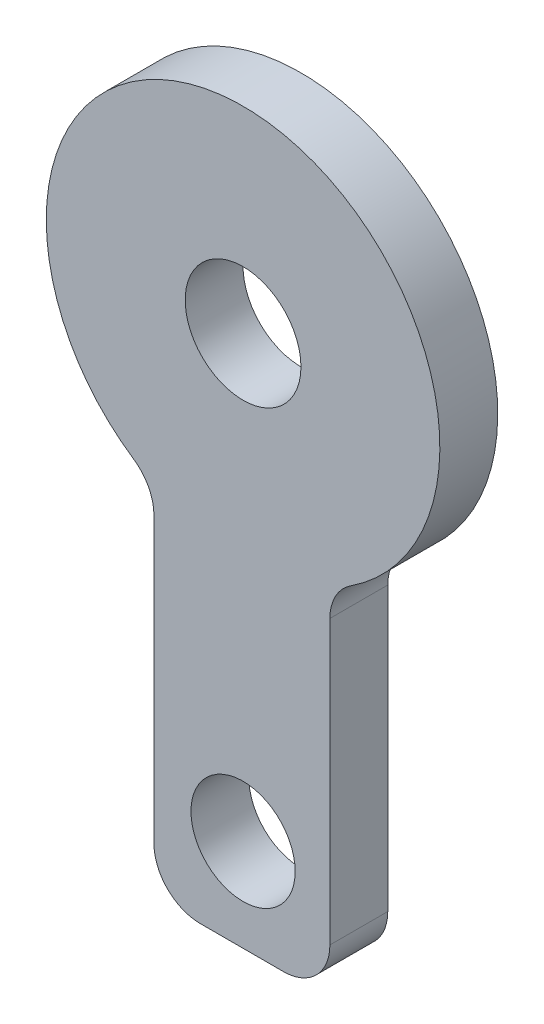
ISO-10303-21;
HEADER;
FILE_DESCRIPTION(('STEP AP214'),'2;1');
FILE_NAME('part.step','',(''),(''),'','','');
FILE_SCHEMA(('AUTOMOTIVE_DESIGN { 1 0 10303 214 1 1 1 1 }'));
ENDSEC;
DATA;
#1=APPLICATION_CONTEXT('core data for automotive mechanical design processes');
#2=APPLICATION_PROTOCOL_DEFINITION('international standard','automotive_design',2000,#1);
#3=PRODUCT_CONTEXT('',#1,'mechanical');
#4=PRODUCT('Part','Part','',(#3));
#5=PRODUCT_RELATED_PRODUCT_CATEGORY('part','',(#4));
#6=PRODUCT_DEFINITION_FORMATION('','',#4);
#7=PRODUCT_DEFINITION_CONTEXT('part definition',#1,'design');
#8=PRODUCT_DEFINITION('design','',#6,#7);
#9=PRODUCT_DEFINITION_SHAPE('','',#8);
#10=(LENGTH_UNIT() NAMED_UNIT(*) SI_UNIT(.MILLI.,.METRE.));
#11=(NAMED_UNIT(*) PLANE_ANGLE_UNIT() SI_UNIT($,.RADIAN.));
#12=(NAMED_UNIT(*) SI_UNIT($,.STERADIAN.) SOLID_ANGLE_UNIT());
#13=UNCERTAINTY_MEASURE_WITH_UNIT(LENGTH_MEASURE(1.E-05),#10,'distance_accuracy_value','');
#14=(GEOMETRIC_REPRESENTATION_CONTEXT(3) GLOBAL_UNCERTAINTY_ASSIGNED_CONTEXT((#13)) GLOBAL_UNIT_ASSIGNED_CONTEXT((#10,
#11,#12)) REPRESENTATION_CONTEXT('',''));
#15=CARTESIAN_POINT('',(0.,0.,0.));
#16=DIRECTION('',(0.,0.,1.));
#17=DIRECTION('',(1.,0.,0.));
#18=AXIS2_PLACEMENT_3D('',#15,#16,#17);
#19=CARTESIAN_POINT('',(0.,0.,2.5));
#20=DIRECTION('',(0.,0.,1.));
#21=DIRECTION('',(1.,0.,0.));
#22=AXIS2_PLACEMENT_3D('',#19,#20,#21);
#23=PLANE('',#22);
#24=CARTESIAN_POINT('',(0.,0.,2.5));
#25=DIRECTION('',(0.,0.,1.));
#26=DIRECTION('',(1.,0.,0.));
#27=AXIS2_PLACEMENT_3D('',#24,#25,#26);
#28=CIRCLE('',#27,2.5);
#29=CARTESIAN_POINT('',(2.5,0.,2.5));
#30=VERTEX_POINT('',#29);
#31=EDGE_CURVE('E171',#30,#30,#28,.T.);
#32=ORIENTED_EDGE('',*,*,#31,.F.);
#33=EDGE_LOOP('',(#32));
#34=FACE_BOUND('',#33,.T.);
#35=DIRECTION('',(0.,-1.,0.));
#36=VECTOR('',#35,1.);
#37=CARTESIAN_POINT('',(-3.85,-23.,2.5));
#38=LINE('',#37,#36);
#39=CARTESIAN_POINT('',(-3.85,-8.71937497760018,2.5));
#40=VERTEX_POINT('',#39);
#41=CARTESIAN_POINT('',(-3.85,-21.,2.5));
#42=VERTEX_POINT('',#41);
#43=EDGE_CURVE('E137',#40,#42,#38,.T.);
#44=ORIENTED_EDGE('',*,*,#43,.T.);
#45=CARTESIAN_POINT('',(-1.85,-21.,2.5));
#46=DIRECTION('',(0.,0.,1.));
#47=DIRECTION('',(1.,0.,0.));
#48=AXIS2_PLACEMENT_3D('',#45,#46,#47);
#49=CIRCLE('',#48,2.);
#50=CARTESIAN_POINT('',(-1.85,-23.,2.5));
#51=VERTEX_POINT('',#50);
#52=EDGE_CURVE('E56',#42,#51,#49,.T.);
#53=ORIENTED_EDGE('',*,*,#52,.T.);
#54=DIRECTION('',(1.,0.,0.));
#55=VECTOR('',#54,1.);
#56=CARTESIAN_POINT('',(3.75,-23.,2.5));
#57=LINE('',#56,#55);
#58=CARTESIAN_POINT('',(1.75,-23.,2.5));
#59=VERTEX_POINT('',#58);
#60=EDGE_CURVE('E131',#51,#59,#57,.T.);
#61=ORIENTED_EDGE('',*,*,#60,.T.);
#62=CARTESIAN_POINT('',(1.75,-21.,2.5));
#63=DIRECTION('',(0.,0.,1.));
#64=DIRECTION('',(1.,0.,0.));
#65=AXIS2_PLACEMENT_3D('',#62,#63,#64);
#66=CIRCLE('',#65,2.);
#67=CARTESIAN_POINT('',(3.75,-21.,2.5));
#68=VERTEX_POINT('',#67);
#69=EDGE_CURVE('E155',#59,#68,#66,.T.);
#70=ORIENTED_EDGE('',*,*,#69,.T.);
#71=DIRECTION('',(0.,1.,0.));
#72=VECTOR('',#71,1.);
#73=CARTESIAN_POINT('',(3.75,-23.,2.5));
#74=LINE('',#73,#72);
#75=CARTESIAN_POINT('',(3.75,-8.78564169540279,2.5));
#76=VERTEX_POINT('',#75);
#77=EDGE_CURVE('E162',#68,#76,#74,.T.);
#78=ORIENTED_EDGE('',*,*,#77,.T.);
#79=CARTESIAN_POINT('',(5.75,-8.78564169540279,2.5));
#80=DIRECTION('',(0.,0.,1.));
#81=DIRECTION('',(1.,0.,0.));
#82=AXIS2_PLACEMENT_3D('',#79,#80,#81);
#83=CIRCLE('',#82,2.);
#84=CARTESIAN_POINT('',(4.65476190476191,-7.11218613437369,2.5));
#85=VERTEX_POINT('',#84);
#86=EDGE_CURVE('E110',#76,#85,#83,.F.);
#87=ORIENTED_EDGE('',*,*,#86,.T.);
#88=CARTESIAN_POINT('',(0.,0.,2.5));
#89=DIRECTION('',(0.,0.,1.));
#90=DIRECTION('',(1.,0.,0.));
#91=AXIS2_PLACEMENT_3D('',#88,#89,#90);
#92=CIRCLE('',#91,8.5);
#93=CARTESIAN_POINT('',(-4.73571428571428,-7.05854164853347,2.5));
#94=VERTEX_POINT('',#93);
#95=EDGE_CURVE('E119',#85,#94,#92,.T.);
#96=ORIENTED_EDGE('',*,*,#95,.T.);
#97=CARTESIAN_POINT('',(-5.85,-8.71937497760017,2.5));
#98=DIRECTION('',(0.,0.,1.));
#99=DIRECTION('',(1.,0.,0.));
#100=AXIS2_PLACEMENT_3D('',#97,#98,#99);
#101=CIRCLE('',#100,2.);
#102=EDGE_CURVE('E11',#94,#40,#101,.F.);
#103=ORIENTED_EDGE('',*,*,#102,.T.);
#104=EDGE_LOOP('',(#44,#53,#61,#70,#78,#87,#96,#103));
#105=FACE_BOUND('',#104,.T.);
#106=CARTESIAN_POINT('',(0.,-19.,2.5));
#107=DIRECTION('',(0.,0.,1.));
#108=DIRECTION('',(1.,0.,0.));
#109=AXIS2_PLACEMENT_3D('',#106,#107,#108);
#110=CIRCLE('',#109,2.25);
#111=CARTESIAN_POINT('',(2.25,-19.,2.5));
#112=VERTEX_POINT('',#111);
#113=EDGE_CURVE('E178',#112,#112,#110,.T.);
#114=ORIENTED_EDGE('',*,*,#113,.F.);
#115=EDGE_LOOP('',(#114));
#116=FACE_BOUND('',#115,.T.);
#117=ADVANCED_FACE('F34',(#34,#105,#116),#23,.T.);
#118=CARTESIAN_POINT('',(0.,0.,0.));
#119=DIRECTION('',(0.,0.,1.));
#120=DIRECTION('',(1.,0.,0.));
#121=AXIS2_PLACEMENT_3D('',#118,#119,#120);
#122=PLANE('',#121);
#123=CARTESIAN_POINT('',(0.,0.,0.));
#124=DIRECTION('',(0.,0.,1.));
#125=DIRECTION('',(1.,0.,0.));
#126=AXIS2_PLACEMENT_3D('',#123,#124,#125);
#127=CIRCLE('',#126,2.5);
#128=CARTESIAN_POINT('',(2.5,0.,0.));
#129=VERTEX_POINT('',#128);
#130=EDGE_CURVE('E173',#129,#129,#127,.T.);
#131=ORIENTED_EDGE('',*,*,#130,.T.);
#132=EDGE_LOOP('',(#131));
#133=FACE_BOUND('',#132,.T.);
#134=DIRECTION('',(1.,0.,0.));
#135=VECTOR('',#134,1.);
#136=CARTESIAN_POINT('',(3.75,-23.,0.));
#137=LINE('',#136,#135);
#138=CARTESIAN_POINT('',(-1.85,-23.,0.));
#139=VERTEX_POINT('',#138);
#140=CARTESIAN_POINT('',(1.75,-23.,0.));
#141=VERTEX_POINT('',#140);
#142=EDGE_CURVE('E133',#139,#141,#137,.T.);
#143=ORIENTED_EDGE('',*,*,#142,.F.);
#144=CARTESIAN_POINT('',(-1.85,-21.,0.));
#145=DIRECTION('',(0.,0.,1.));
#146=DIRECTION('',(1.,0.,0.));
#147=AXIS2_PLACEMENT_3D('',#144,#145,#146);
#148=CIRCLE('',#147,2.);
#149=CARTESIAN_POINT('',(-3.85,-21.,0.));
#150=VERTEX_POINT('',#149);
#151=EDGE_CURVE('E153',#139,#150,#148,.F.);
#152=ORIENTED_EDGE('',*,*,#151,.T.);
#153=DIRECTION('',(0.,-1.,0.));
#154=VECTOR('',#153,1.);
#155=CARTESIAN_POINT('',(-3.85,-23.,0.));
#156=LINE('',#155,#154);
#157=CARTESIAN_POINT('',(-3.85,-8.71937497760018,0.));
#158=VERTEX_POINT('',#157);
#159=EDGE_CURVE('E127',#158,#150,#156,.T.);
#160=ORIENTED_EDGE('',*,*,#159,.F.);
#161=CARTESIAN_POINT('',(-5.85,-8.71937497760017,0.));
#162=DIRECTION('',(0.,0.,1.));
#163=DIRECTION('',(1.,0.,0.));
#164=AXIS2_PLACEMENT_3D('',#161,#162,#163);
#165=CIRCLE('',#164,2.);
#166=CARTESIAN_POINT('',(-4.73571428571428,-7.05854164853347,0.));
#167=VERTEX_POINT('',#166);
#168=EDGE_CURVE('E42',#158,#167,#165,.T.);
#169=ORIENTED_EDGE('',*,*,#168,.T.);
#170=CARTESIAN_POINT('',(0.,0.,0.));
#171=DIRECTION('',(0.,0.,1.));
#172=DIRECTION('',(1.,0.,0.));
#173=AXIS2_PLACEMENT_3D('',#170,#171,#172);
#174=CIRCLE('',#173,8.5);
#175=CARTESIAN_POINT('',(4.65476190476191,-7.11218613437369,0.));
#176=VERTEX_POINT('',#175);
#177=EDGE_CURVE('E116',#176,#167,#174,.T.);
#178=ORIENTED_EDGE('',*,*,#177,.F.);
#179=CARTESIAN_POINT('',(5.75,-8.78564169540279,0.));
#180=DIRECTION('',(0.,0.,1.));
#181=DIRECTION('',(1.,0.,0.));
#182=AXIS2_PLACEMENT_3D('',#179,#180,#181);
#183=CIRCLE('',#182,2.);
#184=CARTESIAN_POINT('',(3.75,-8.78564169540279,0.));
#185=VERTEX_POINT('',#184);
#186=EDGE_CURVE('E100',#176,#185,#183,.T.);
#187=ORIENTED_EDGE('',*,*,#186,.T.);
#188=DIRECTION('',(0.,1.,0.));
#189=VECTOR('',#188,1.);
#190=CARTESIAN_POINT('',(3.75,-23.,0.));
#191=LINE('',#190,#189);
#192=CARTESIAN_POINT('',(3.75,-21.,0.));
#193=VERTEX_POINT('',#192);
#194=EDGE_CURVE('E128',#193,#185,#191,.T.);
#195=ORIENTED_EDGE('',*,*,#194,.F.);
#196=CARTESIAN_POINT('',(1.75,-21.,0.));
#197=DIRECTION('',(0.,0.,1.));
#198=DIRECTION('',(1.,0.,0.));
#199=AXIS2_PLACEMENT_3D('',#196,#197,#198);
#200=CIRCLE('',#199,2.);
#201=EDGE_CURVE('E151',#193,#141,#200,.F.);
#202=ORIENTED_EDGE('',*,*,#201,.T.);
#203=EDGE_LOOP('',(#143,#152,#160,#169,#178,#187,#195,#202));
#204=FACE_BOUND('',#203,.T.);
#205=CARTESIAN_POINT('',(0.,-19.,0.));
#206=DIRECTION('',(0.,0.,1.));
#207=DIRECTION('',(1.,0.,0.));
#208=AXIS2_PLACEMENT_3D('',#205,#206,#207);
#209=CIRCLE('',#208,2.25);
#210=CARTESIAN_POINT('',(2.25,-19.,0.));
#211=VERTEX_POINT('',#210);
#212=EDGE_CURVE('E180',#211,#211,#209,.T.);
#213=ORIENTED_EDGE('',*,*,#212,.T.);
#214=EDGE_LOOP('',(#213));
#215=FACE_BOUND('',#214,.T.);
#216=ADVANCED_FACE('F124',(#133,#204,#215),#122,.F.);
#217=CARTESIAN_POINT('',(3.75,-23.,2.5));
#218=DIRECTION('',(0.,1.,0.));
#219=DIRECTION('',(0.,0.,1.));
#220=AXIS2_PLACEMENT_3D('',#217,#218,#219);
#221=PLANE('',#220);
#222=ORIENTED_EDGE('',*,*,#60,.F.);
#223=DIRECTION('',(0.,0.,-1.));
#224=VECTOR('',#223,1.);
#225=CARTESIAN_POINT('',(-1.85,-23.,2.5));
#226=LINE('',#225,#224);
#227=EDGE_CURVE('E148',#51,#139,#226,.T.);
#228=ORIENTED_EDGE('',*,*,#227,.T.);
#229=ORIENTED_EDGE('',*,*,#142,.T.);
#230=DIRECTION('',(0.,0.,-1.));
#231=VECTOR('',#230,1.);
#232=CARTESIAN_POINT('',(1.75,-23.,2.5));
#233=LINE('',#232,#231);
#234=EDGE_CURVE('E49',#141,#59,#233,.F.);
#235=ORIENTED_EDGE('',*,*,#234,.T.);
#236=EDGE_LOOP('',(#222,#228,#229,#235));
#237=FACE_BOUND('',#236,.T.);
#238=ADVANCED_FACE('F194',(#237),#221,.F.);
#239=CARTESIAN_POINT('',(3.75,-23.,2.5));
#240=DIRECTION('',(-1.,0.,0.));
#241=DIRECTION('',(0.,0.,1.));
#242=AXIS2_PLACEMENT_3D('',#239,#240,#241);
#243=PLANE('',#242);
#244=ORIENTED_EDGE('',*,*,#194,.T.);
#245=DIRECTION('',(0.,0.,1.));
#246=VECTOR('',#245,1.);
#247=CARTESIAN_POINT('',(3.75,-8.78564169540279,2.5));
#248=LINE('',#247,#246);
#249=EDGE_CURVE('E105',#185,#76,#248,.T.);
#250=ORIENTED_EDGE('',*,*,#249,.T.);
#251=ORIENTED_EDGE('',*,*,#77,.F.);
#252=DIRECTION('',(0.,0.,-1.));
#253=VECTOR('',#252,1.);
#254=CARTESIAN_POINT('',(3.75,-21.,2.5));
#255=LINE('',#254,#253);
#256=EDGE_CURVE('E120',#68,#193,#255,.T.);
#257=ORIENTED_EDGE('',*,*,#256,.T.);
#258=EDGE_LOOP('',(#244,#250,#251,#257));
#259=FACE_BOUND('',#258,.T.);
#260=ADVANCED_FACE('F207',(#259),#243,.F.);
#261=CARTESIAN_POINT('',(0.,0.,2.5));
#262=DIRECTION('',(0.,0.,-1.));
#263=DIRECTION('',(-1.,0.,0.));
#264=AXIS2_PLACEMENT_3D('',#261,#262,#263);
#265=CYLINDRICAL_SURFACE('',#264,8.5);
#266=ORIENTED_EDGE('',*,*,#95,.F.);
#267=DIRECTION('',(0.,0.,-1.));
#268=VECTOR('',#267,1.);
#269=CARTESIAN_POINT('',(4.65476190476191,-7.11218613437369,2.5));
#270=LINE('',#269,#268);
#271=EDGE_CURVE('E104',#85,#176,#270,.T.);
#272=ORIENTED_EDGE('',*,*,#271,.T.);
#273=ORIENTED_EDGE('',*,*,#177,.T.);
#274=DIRECTION('',(0.,0.,-1.));
#275=VECTOR('',#274,1.);
#276=CARTESIAN_POINT('',(-4.73571428571428,-7.05854164853347,2.5));
#277=LINE('',#276,#275);
#278=EDGE_CURVE('E121',#167,#94,#277,.F.);
#279=ORIENTED_EDGE('',*,*,#278,.T.);
#280=EDGE_LOOP('',(#266,#272,#273,#279));
#281=FACE_BOUND('',#280,.T.);
#282=ADVANCED_FACE('F115',(#281),#265,.T.);
#283=CARTESIAN_POINT('',(-3.85,-23.,2.5));
#284=DIRECTION('',(1.,0.,0.));
#285=DIRECTION('',(0.,1.,0.));
#286=AXIS2_PLACEMENT_3D('',#283,#284,#285);
#287=PLANE('',#286);
#288=ORIENTED_EDGE('',*,*,#43,.F.);
#289=DIRECTION('',(0.,0.,1.));
#290=VECTOR('',#289,1.);
#291=CARTESIAN_POINT('',(-3.85,-8.71937497760017,0.));
#292=LINE('',#291,#290);
#293=EDGE_CURVE('E144',#40,#158,#292,.F.);
#294=ORIENTED_EDGE('',*,*,#293,.T.);
#295=ORIENTED_EDGE('',*,*,#159,.T.);
#296=DIRECTION('',(0.,0.,-1.));
#297=VECTOR('',#296,1.);
#298=CARTESIAN_POINT('',(-3.85,-21.,2.5));
#299=LINE('',#298,#297);
#300=EDGE_CURVE('E142',#150,#42,#299,.F.);
#301=ORIENTED_EDGE('',*,*,#300,.T.);
#302=EDGE_LOOP('',(#288,#294,#295,#301));
#303=FACE_BOUND('',#302,.T.);
#304=ADVANCED_FACE('F201',(#303),#287,.F.);
#305=CARTESIAN_POINT('',(0.,0.,2.5));
#306=DIRECTION('',(0.,0.,-1.));
#307=DIRECTION('',(-1.,0.,0.));
#308=AXIS2_PLACEMENT_3D('',#305,#306,#307);
#309=CYLINDRICAL_SURFACE('',#308,2.5);
#310=ORIENTED_EDGE('',*,*,#31,.T.);
#311=EDGE_LOOP('',(#310));
#312=FACE_BOUND('',#311,.T.);
#313=ORIENTED_EDGE('',*,*,#130,.F.);
#314=EDGE_LOOP('',(#313));
#315=FACE_BOUND('',#314,.T.);
#316=ADVANCED_FACE('F198',(#312,#315),#309,.F.);
#317=CARTESIAN_POINT('',(0.,-19.,2.5));
#318=DIRECTION('',(0.,0.,-1.));
#319=DIRECTION('',(-1.,0.,0.));
#320=AXIS2_PLACEMENT_3D('',#317,#318,#319);
#321=CYLINDRICAL_SURFACE('',#320,2.25);
#322=ORIENTED_EDGE('',*,*,#113,.T.);
#323=EDGE_LOOP('',(#322));
#324=FACE_BOUND('',#323,.T.);
#325=ORIENTED_EDGE('',*,*,#212,.F.);
#326=EDGE_LOOP('',(#325));
#327=FACE_BOUND('',#326,.T.);
#328=ADVANCED_FACE('F186',(#324,#327),#321,.F.);
#329=CARTESIAN_POINT('',(5.75,-8.78564169540279,2.5));
#330=DIRECTION('',(0.,0.,-1.));
#331=DIRECTION('',(-1.,0.,0.));
#332=AXIS2_PLACEMENT_3D('',#329,#330,#331);
#333=CYLINDRICAL_SURFACE('',#332,2.);
#334=ORIENTED_EDGE('',*,*,#86,.F.);
#335=ORIENTED_EDGE('',*,*,#249,.F.);
#336=ORIENTED_EDGE('',*,*,#186,.F.);
#337=ORIENTED_EDGE('',*,*,#271,.F.);
#338=EDGE_LOOP('',(#334,#335,#336,#337));
#339=FACE_BOUND('',#338,.T.);
#340=ADVANCED_FACE('F103',(#339),#333,.F.);
#341=CARTESIAN_POINT('',(-5.85,-8.71937497760017,2.5));
#342=DIRECTION('',(0.,0.,-1.));
#343=DIRECTION('',(-1.,0.,0.));
#344=AXIS2_PLACEMENT_3D('',#341,#342,#343);
#345=CYLINDRICAL_SURFACE('',#344,2.);
#346=ORIENTED_EDGE('',*,*,#102,.F.);
#347=ORIENTED_EDGE('',*,*,#278,.F.);
#348=ORIENTED_EDGE('',*,*,#168,.F.);
#349=ORIENTED_EDGE('',*,*,#293,.F.);
#350=EDGE_LOOP('',(#346,#347,#348,#349));
#351=FACE_BOUND('',#350,.T.);
#352=ADVANCED_FACE('F214',(#351),#345,.F.);
#353=CARTESIAN_POINT('',(-1.85,-21.,2.5));
#354=DIRECTION('',(0.,0.,-1.));
#355=DIRECTION('',(-1.,0.,0.));
#356=AXIS2_PLACEMENT_3D('',#353,#354,#355);
#357=CYLINDRICAL_SURFACE('',#356,2.);
#358=ORIENTED_EDGE('',*,*,#52,.F.);
#359=ORIENTED_EDGE('',*,*,#300,.F.);
#360=ORIENTED_EDGE('',*,*,#151,.F.);
#361=ORIENTED_EDGE('',*,*,#227,.F.);
#362=EDGE_LOOP('',(#358,#359,#360,#361));
#363=FACE_BOUND('',#362,.T.);
#364=ADVANCED_FACE('F216',(#363),#357,.T.);
#365=CARTESIAN_POINT('',(1.75,-21.,2.5));
#366=DIRECTION('',(0.,0.,-1.));
#367=DIRECTION('',(-1.,0.,0.));
#368=AXIS2_PLACEMENT_3D('',#365,#366,#367);
#369=CYLINDRICAL_SURFACE('',#368,2.);
#370=ORIENTED_EDGE('',*,*,#69,.F.);
#371=ORIENTED_EDGE('',*,*,#234,.F.);
#372=ORIENTED_EDGE('',*,*,#201,.F.);
#373=ORIENTED_EDGE('',*,*,#256,.F.);
#374=EDGE_LOOP('',(#370,#371,#372,#373));
#375=FACE_BOUND('',#374,.T.);
#376=ADVANCED_FACE('F36',(#375),#369,.T.);
#377=CLOSED_SHELL('',(#117,#216,#238,#260,#282,#304,#316,#328,#340,#352,#364,#376));
#378=MANIFOLD_SOLID_BREP('B2',#377);
#379=ADVANCED_BREP_SHAPE_REPRESENTATION('',(#18,#378),#14);
#380=SHAPE_DEFINITION_REPRESENTATION(#9,#379);
ENDSEC;
END-ISO-10303-21;
